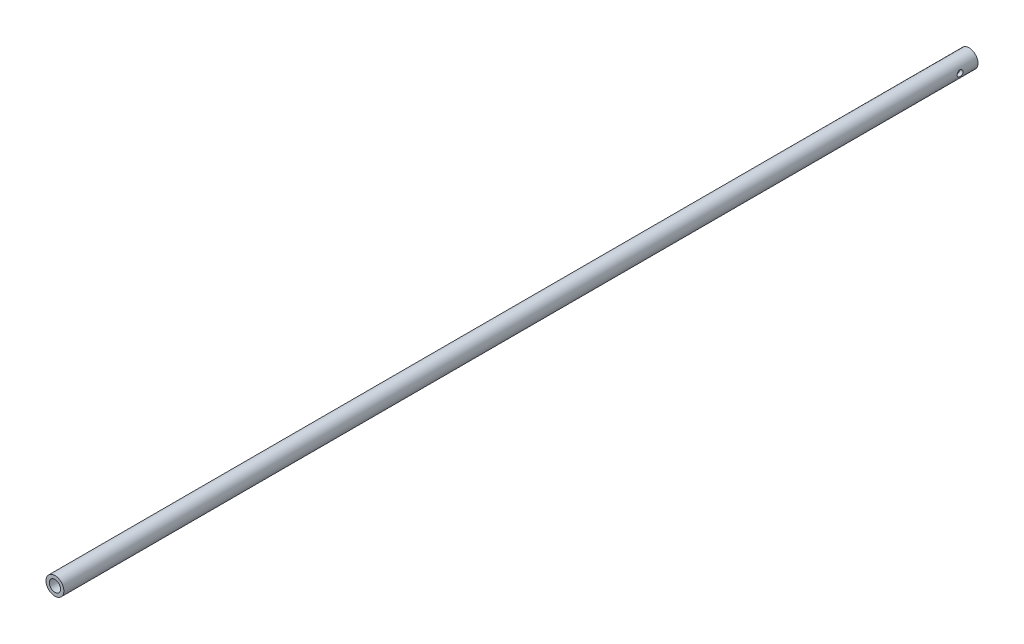
ISO-10303-21;
HEADER;
FILE_DESCRIPTION(('STEP AP214'),'2;1');
FILE_NAME('part.step','',(''),(''),'','','');
FILE_SCHEMA(('AUTOMOTIVE_DESIGN { 1 0 10303 214 1 1 1 1 }'));
ENDSEC;
DATA;
#1=APPLICATION_CONTEXT('core data for automotive mechanical design processes');
#2=APPLICATION_PROTOCOL_DEFINITION('international standard','automotive_design',2000,#1);
#3=PRODUCT_CONTEXT('',#1,'mechanical');
#4=PRODUCT('Part','Part','',(#3));
#5=PRODUCT_RELATED_PRODUCT_CATEGORY('part','',(#4));
#6=PRODUCT_DEFINITION_FORMATION('','',#4);
#7=PRODUCT_DEFINITION_CONTEXT('part definition',#1,'design');
#8=PRODUCT_DEFINITION('design','',#6,#7);
#9=PRODUCT_DEFINITION_SHAPE('','',#8);
#10=(LENGTH_UNIT() NAMED_UNIT(*) SI_UNIT(.MILLI.,.METRE.));
#11=(NAMED_UNIT(*) PLANE_ANGLE_UNIT() SI_UNIT($,.RADIAN.));
#12=(NAMED_UNIT(*) SI_UNIT($,.STERADIAN.) SOLID_ANGLE_UNIT());
#13=UNCERTAINTY_MEASURE_WITH_UNIT(LENGTH_MEASURE(1.E-05),#10,'distance_accuracy_value','');
#14=(GEOMETRIC_REPRESENTATION_CONTEXT(3) GLOBAL_UNCERTAINTY_ASSIGNED_CONTEXT((#13)) GLOBAL_UNIT_ASSIGNED_CONTEXT((#10,
#11,#12)) REPRESENTATION_CONTEXT('',''));
#15=CARTESIAN_POINT('',(0.,0.,0.));
#16=DIRECTION('',(0.,0.,1.));
#17=DIRECTION('',(1.,0.,0.));
#18=AXIS2_PLACEMENT_3D('',#15,#16,#17);
#19=CARTESIAN_POINT('',(0.,0.,243.84));
#20=DIRECTION('',(0.,0.,1.));
#21=DIRECTION('',(1.,0.,0.));
#22=AXIS2_PLACEMENT_3D('',#19,#20,#21);
#23=PLANE('',#22);
#24=CARTESIAN_POINT('',(0.,0.,243.84));
#25=DIRECTION('',(0.,0.,1.));
#26=DIRECTION('',(1.,0.,0.));
#27=AXIS2_PLACEMENT_3D('',#24,#25,#26);
#28=CIRCLE('',#27,2.3876);
#29=CARTESIAN_POINT('',(2.3876,0.,243.84));
#30=VERTEX_POINT('',#29);
#31=EDGE_CURVE('E10',#30,#30,#28,.T.);
#32=ORIENTED_EDGE('',*,*,#31,.T.);
#33=EDGE_LOOP('',(#32));
#34=FACE_BOUND('',#33,.T.);
#35=CARTESIAN_POINT('',(0.,0.,243.84));
#36=DIRECTION('',(0.,0.,1.));
#37=DIRECTION('',(1.,0.,0.));
#38=AXIS2_PLACEMENT_3D('',#35,#36,#37);
#39=CIRCLE('',#38,1.4986);
#40=CARTESIAN_POINT('',(1.4986,0.,243.84));
#41=VERTEX_POINT('',#40);
#42=EDGE_CURVE('E49',#41,#41,#39,.T.);
#43=ORIENTED_EDGE('',*,*,#42,.F.);
#44=EDGE_LOOP('',(#43));
#45=FACE_BOUND('',#44,.T.);
#46=ADVANCED_FACE('F31',(#34,#45),#23,.T.);
#47=CARTESIAN_POINT('',(0.,0.,0.));
#48=DIRECTION('',(0.,0.,1.));
#49=DIRECTION('',(1.,0.,0.));
#50=AXIS2_PLACEMENT_3D('',#47,#48,#49);
#51=PLANE('',#50);
#52=CARTESIAN_POINT('',(0.,0.,0.));
#53=DIRECTION('',(0.,0.,1.));
#54=DIRECTION('',(1.,0.,0.));
#55=AXIS2_PLACEMENT_3D('',#52,#53,#54);
#56=CIRCLE('',#55,2.3876);
#57=CARTESIAN_POINT('',(2.3876,0.,0.));
#58=VERTEX_POINT('',#57);
#59=EDGE_CURVE('E44',#58,#58,#56,.T.);
#60=ORIENTED_EDGE('',*,*,#59,.F.);
#61=EDGE_LOOP('',(#60));
#62=FACE_BOUND('',#61,.T.);
#63=CARTESIAN_POINT('',(0.,0.,0.));
#64=DIRECTION('',(0.,0.,1.));
#65=DIRECTION('',(1.,0.,0.));
#66=AXIS2_PLACEMENT_3D('',#63,#64,#65);
#67=CIRCLE('',#66,1.4986);
#68=CARTESIAN_POINT('',(1.4986,0.,0.));
#69=VERTEX_POINT('',#68);
#70=EDGE_CURVE('E52',#69,#69,#67,.T.);
#71=ORIENTED_EDGE('',*,*,#70,.T.);
#72=EDGE_LOOP('',(#71));
#73=FACE_BOUND('',#72,.T.);
#74=ADVANCED_FACE('F85',(#62,#73),#51,.F.);
#75=CARTESIAN_POINT('',(0.,0.,243.84));
#76=DIRECTION('',(0.,0.,-1.));
#77=DIRECTION('',(-1.,0.,0.));
#78=AXIS2_PLACEMENT_3D('',#75,#76,#77);
#79=CYLINDRICAL_SURFACE('',#78,2.3876);
#80=CARTESIAN_POINT('',(-2.3876,0.,3.96875));
#81=CARTESIAN_POINT('',(-2.387600104954,0.04331618713427,3.96874982141756));
#82=CARTESIAN_POINT('',(-2.38641034730664,0.0866313433192571,3.97230728899652));
#83=CARTESIAN_POINT('',(-2.38178134321832,0.171986217616656,3.98639988803204));
#84=CARTESIAN_POINT('',(-2.37834185140834,0.214025796083791,3.99693578059759));
#85=CARTESIAN_POINT('',(-2.36958719298901,0.295586633292587,4.02458444744971));
#86=CARTESIAN_POINT('',(-2.36427515302001,0.335111961065766,4.04168626266866));
#87=CARTESIAN_POINT('',(-2.35231787736739,0.410733349069189,4.08193191079319));
#88=CARTESIAN_POINT('',(-2.34567238094995,0.446828736598123,4.10507692560663));
#89=CARTESIAN_POINT('',(-2.33149162603547,0.515809889195975,4.15758996265754));
#90=CARTESIAN_POINT('',(-2.32393513707995,0.548561078257333,4.18712899830712));
#91=CARTESIAN_POINT('',(-2.30890113468207,0.608747489028168,4.25122794606544));
#92=CARTESIAN_POINT('',(-2.30142363884492,0.636181548393056,4.28578895311337));
#93=CARTESIAN_POINT('',(-2.28716089878583,0.685721479166213,4.360160324732));
#94=CARTESIAN_POINT('',(-2.28040153954085,0.707652707431604,4.40009246455093));
#95=CARTESIAN_POINT('',(-2.26866304334843,0.744430782618014,4.48333930923541));
#96=CARTESIAN_POINT('',(-2.26368336654978,0.759279778330762,4.52665298347593));
#97=CARTESIAN_POINT('',(-2.25629154604765,0.780967569009525,4.61390361676776));
#98=CARTESIAN_POINT('',(-2.2537988584141,0.788058418308084,4.65777089746612));
#99=CARTESIAN_POINT('',(-2.25142498297933,0.794816554072336,4.74613792777547));
#100=CARTESIAN_POINT('',(-2.25154299326961,0.794486120077496,4.7906374789797));
#101=CARTESIAN_POINT('',(-2.25430657392201,0.78660683748293,4.87685896957575));
#102=CARTESIAN_POINT('',(-2.25683708950154,0.779386558228351,4.91861526181227));
#103=CARTESIAN_POINT('',(-2.26395234914436,0.758468407488654,5.00028619104303));
#104=CARTESIAN_POINT('',(-2.26853733793094,0.744769764307596,5.04020060801315));
#105=CARTESIAN_POINT('',(-2.27932718406608,0.711067915908021,5.11780284353296));
#106=CARTESIAN_POINT('',(-2.2855568463045,0.690967102630071,5.15544467383786));
#107=CARTESIAN_POINT('',(-2.29892367992039,0.645099267013881,5.22692508684221));
#108=CARTESIAN_POINT('',(-2.30606111205869,0.619330615006975,5.26076257144424));
#109=CARTESIAN_POINT('',(-2.32089230801147,0.561279055390644,5.32552054078693));
#110=CARTESIAN_POINT('',(-2.32859571772908,0.528727421778223,5.35619840980791));
#111=CARTESIAN_POINT('',(-2.34336664467415,0.45884673949731,5.41172295777575));
#112=CARTESIAN_POINT('',(-2.35043410152258,0.421517238018774,5.43656908340097));
#113=CARTESIAN_POINT('',(-2.36322873023916,0.34262794242784,5.47991881401616));
#114=CARTESIAN_POINT('',(-2.36894205617047,0.301030199979737,5.49835772652146));
#115=CARTESIAN_POINT('',(-2.37828419008409,0.215088012977365,5.52790115902589));
#116=CARTESIAN_POINT('',(-2.38191371810039,0.170744523061257,5.53900821266899));
#117=CARTESIAN_POINT('',(-2.38656017760424,0.0826237435658498,5.55314353746814));
#118=CARTESIAN_POINT('',(-2.38768306787278,0.0389045626786965,5.55649967540858));
#119=CARTESIAN_POINT('',(-2.38750733002936,-0.0484807897908551,5.55597144121422));
#120=CARTESIAN_POINT('',(-2.38620910820413,-0.0921469690370237,5.55208828390528));
#121=CARTESIAN_POINT('',(-2.3814069364073,-0.176876625580169,5.53745128777215));
#122=CARTESIAN_POINT('',(-2.37796754978706,-0.217978840730672,5.52689842591333));
#123=CARTESIAN_POINT('',(-2.36929415723819,-0.297813099480496,5.4994725890578));
#124=CARTESIAN_POINT('',(-2.36405992270278,-0.336544840415545,5.48259880895099));
#125=CARTESIAN_POINT('',(-2.35215776873451,-0.411670876866391,5.44251930049423));
#126=CARTESIAN_POINT('',(-2.34545584925548,-0.447977229413894,5.41915911466913));
#127=CARTESIAN_POINT('',(-2.33137843043207,-0.516261414109196,5.36695154225324));
#128=CARTESIAN_POINT('',(-2.3240027266987,-0.548237925471455,5.33810248774977));
#129=CARTESIAN_POINT('',(-2.30898671836576,-0.608458157330225,5.2741942230661));
#130=CARTESIAN_POINT('',(-2.30134951552824,-0.636467943952485,5.23891331757426));
#131=CARTESIAN_POINT('',(-2.28701507580633,-0.686198082341363,5.16398806235609));
#132=CARTESIAN_POINT('',(-2.28031784560392,-0.707918389399131,5.12434368161471));
#133=CARTESIAN_POINT('',(-2.26868751511924,-0.744350614658596,5.04180450943163));
#134=CARTESIAN_POINT('',(-2.26375068754584,-0.759077362500693,4.99891682138304));
#135=CARTESIAN_POINT('',(-2.2562705976153,-0.781033878192632,4.91106839667613));
#136=CARTESIAN_POINT('',(-2.2537262645755,-0.788266999717382,4.86610859678239));
#137=CARTESIAN_POINT('',(-2.25144056067256,-0.794770276420756,4.77786423421202));
#138=CARTESIAN_POINT('',(-2.2515625812761,-0.794428511504645,4.73461149045411));
#139=CARTESIAN_POINT('',(-2.25425833857885,-0.786746017590526,4.64881394057495));
#140=CARTESIAN_POINT('',(-2.25683193083175,-0.779405700946309,4.6062690928948));
#141=CARTESIAN_POINT('',(-2.26403940423301,-0.75820853464893,4.52389002531972));
#142=CARTESIAN_POINT('',(-2.26863366415936,-0.744476721468039,4.48401989391558));
#143=CARTESIAN_POINT('',(-2.279350374539,-0.710987542677714,4.40711890186192));
#144=CARTESIAN_POINT('',(-2.2854731629997,-0.691228844113126,4.37008867157765));
#145=CARTESIAN_POINT('',(-2.29888867630584,-0.645245046617742,4.29817503194798));
#146=CARTESIAN_POINT('',(-2.30622067152414,-0.618776315877545,4.2634547766596));
#147=CARTESIAN_POINT('',(-2.32106325199321,-0.560536420619283,4.19882337826886));
#148=CARTESIAN_POINT('',(-2.32857388710218,-0.528763760529606,4.16891359628003));
#149=CARTESIAN_POINT('',(-2.34327631353338,-0.459341694996789,4.1135862488819));
#150=CARTESIAN_POINT('',(-2.35044452759944,-0.421512485361231,4.08838724766165));
#151=CARTESIAN_POINT('',(-2.36333382041995,-0.341919717168496,4.0447336186308));
#152=CARTESIAN_POINT('',(-2.36905527799824,-0.300157192463443,4.02627722474796));
#153=CARTESIAN_POINT('',(-2.37818050482714,-0.215877269984439,3.99743360510169));
#154=CARTESIAN_POINT('',(-2.38167954556196,-0.173484937915579,3.98671153215144));
#155=CARTESIAN_POINT('',(-2.38638892814132,-0.0873944812509105,3.97237078824566));
#156=CARTESIAN_POINT('',(-2.38759989412399,-0.0436967160542328,3.96875018015127));
#157=CARTESIAN_POINT('',(-2.3876,0.,3.96875));
#158=B_SPLINE_CURVE_WITH_KNOTS('',3,(#80,#81,#82,#83,#84,#85,#86,#87,#88,#89,#90,#91,#92,#93,
#94,#95,#96,#97,#98,#99,#100,#101,#102,#103,#104,#105,#106,#107,#108,#109,#110,#111,#112,#113,
#114,#115,#116,#117,#118,#119,#120,#121,#122,#123,#124,#125,#126,#127,#128,#129,#130,#131,#132,
#133,#134,#135,#136,#137,#138,#139,#140,#141,#142,#143,#144,#145,#146,#147,#148,#149,#150,#151,
#152,#153,#154,#155,#156,#157),.UNSPECIFIED.,.T.,.F.,(4,2,2,2,2,2,2,2,2,2,2,2,2,2,2,2,2,2,2,2,2,
2,2,2,2,2,2,2,2,2,2,2,2,2,2,2,2,2,4),(0.,0.129787768732333,0.259589695230469,0.38917590687746,
0.51878748155148,0.6524262908371,0.786094281200943,0.923581629359143,1.0610272364553,
1.19386103070647,1.32665402396379,1.45341505975981,1.58019119900268,1.70900098516398,
1.83784785641812,1.97338345216388,2.10893190246884,2.24581169574993,2.38264416317856,
2.51357331290481,2.64448049339282,2.7716197523065,2.89877521075353,3.02926548650142,
3.15979547808463,3.29622310821877,3.43265170812672,3.56878970890293,3.70486675653546,
3.83398914573841,3.9631039275365,4.08979265751137,4.2165094273411,4.34873121933904,
4.48099035765252,4.61836636682183,4.75570636763581,4.88667003984324,5.01759798278589),.UNSPECIFIED.);
#159=CARTESIAN_POINT('',(-2.3876,0.,3.96875));
#160=VERTEX_POINT('',#159);
#161=EDGE_CURVE('E75',#160,#160,#158,.T.);
#162=ORIENTED_EDGE('',*,*,#161,.T.);
#163=EDGE_LOOP('',(#162));
#164=FACE_BOUND('',#163,.T.);
#165=CARTESIAN_POINT('',(2.3876,0.,3.96875));
#166=CARTESIAN_POINT('',(2.387600104954,-0.0433161871342706,3.96874982141756));
#167=CARTESIAN_POINT('',(2.38641034730664,-0.0866313433192578,3.97230728899652));
#168=CARTESIAN_POINT('',(2.38178134321832,-0.171986217616656,3.98639988803204));
#169=CARTESIAN_POINT('',(2.37834185140834,-0.214025796083791,3.99693578059759));
#170=CARTESIAN_POINT('',(2.36958719298901,-0.295586633292588,4.02458444744971));
#171=CARTESIAN_POINT('',(2.36427515302001,-0.335111961065767,4.04168626266866));
#172=CARTESIAN_POINT('',(2.35231787736739,-0.41073334906919,4.08193191079319));
#173=CARTESIAN_POINT('',(2.34567238094995,-0.446828736598124,4.10507692560663));
#174=CARTESIAN_POINT('',(2.33149162603547,-0.515809889195977,4.15758996265754));
#175=CARTESIAN_POINT('',(2.32393513707995,-0.548561078257334,4.18712899830712));
#176=CARTESIAN_POINT('',(2.30890113468207,-0.608747489028169,4.25122794606544));
#177=CARTESIAN_POINT('',(2.30142363884492,-0.636181548393058,4.28578895311336));
#178=CARTESIAN_POINT('',(2.28716089878583,-0.685721479166214,4.360160324732));
#179=CARTESIAN_POINT('',(2.28040153954085,-0.707652707431605,4.40009246455093));
#180=CARTESIAN_POINT('',(2.26866304334843,-0.744430782618015,4.48333930923541));
#181=CARTESIAN_POINT('',(2.26368336654978,-0.759279778330763,4.52665298347593));
#182=CARTESIAN_POINT('',(2.25629154604765,-0.780967569009526,4.61390361676776));
#183=CARTESIAN_POINT('',(2.2537988584141,-0.788058418308085,4.65777089746612));
#184=CARTESIAN_POINT('',(2.25142498297933,-0.794816554072337,4.74613792777547));
#185=CARTESIAN_POINT('',(2.25154299326961,-0.794486120077497,4.7906374789797));
#186=CARTESIAN_POINT('',(2.25430657392201,-0.786606837482931,4.87685896957575));
#187=CARTESIAN_POINT('',(2.25683708950154,-0.779386558228352,4.91861526181227));
#188=CARTESIAN_POINT('',(2.26395234914436,-0.758468407488655,5.00028619104303));
#189=CARTESIAN_POINT('',(2.26853733793094,-0.744769764307597,5.04020060801315));
#190=CARTESIAN_POINT('',(2.27932718406608,-0.711067915908023,5.11780284353296));
#191=CARTESIAN_POINT('',(2.2855568463045,-0.690967102630072,5.15544467383786));
#192=CARTESIAN_POINT('',(2.29892367992039,-0.645099267013882,5.22692508684221));
#193=CARTESIAN_POINT('',(2.30606111205869,-0.619330615006976,5.26076257144424));
#194=CARTESIAN_POINT('',(2.32089230801147,-0.561279055390645,5.32552054078693));
#195=CARTESIAN_POINT('',(2.32859571772908,-0.528727421778224,5.35619840980791));
#196=CARTESIAN_POINT('',(2.34336664467415,-0.458846739497311,5.41172295777575));
#197=CARTESIAN_POINT('',(2.35043410152258,-0.421517238018775,5.43656908340097));
#198=CARTESIAN_POINT('',(2.36322873023916,-0.342627942427841,5.47991881401616));
#199=CARTESIAN_POINT('',(2.36894205617047,-0.301030199979738,5.49835772652146));
#200=CARTESIAN_POINT('',(2.37828419008409,-0.215088012977367,5.52790115902589));
#201=CARTESIAN_POINT('',(2.38191371810039,-0.170744523061258,5.53900821266899));
#202=CARTESIAN_POINT('',(2.38656017760424,-0.0826237435658511,5.55314353746814));
#203=CARTESIAN_POINT('',(2.38768306787278,-0.0389045626786979,5.55649967540858));
#204=CARTESIAN_POINT('',(2.38750733002936,0.0484807897908537,5.55597144121422));
#205=CARTESIAN_POINT('',(2.38620910820413,0.0921469690370224,5.55208828390528));
#206=CARTESIAN_POINT('',(2.3814069364073,0.176876625580168,5.53745128777215));
#207=CARTESIAN_POINT('',(2.37796754978706,0.217978840730671,5.52689842591333));
#208=CARTESIAN_POINT('',(2.36929415723819,0.297813099480494,5.4994725890578));
#209=CARTESIAN_POINT('',(2.36405992270278,0.336544840415544,5.48259880895099));
#210=CARTESIAN_POINT('',(2.35215776873451,0.41167087686639,5.44251930049423));
#211=CARTESIAN_POINT('',(2.34545584925548,0.447977229413893,5.41915911466913));
#212=CARTESIAN_POINT('',(2.33137843043207,0.516261414109195,5.36695154225324));
#213=CARTESIAN_POINT('',(2.3240027266987,0.548237925471454,5.33810248774977));
#214=CARTESIAN_POINT('',(2.30898671836576,0.608458157330224,5.2741942230661));
#215=CARTESIAN_POINT('',(2.30134951552824,0.636467943952484,5.23891331757426));
#216=CARTESIAN_POINT('',(2.28701507580633,0.686198082341362,5.16398806235609));
#217=CARTESIAN_POINT('',(2.28031784560392,0.70791838939913,5.12434368161471));
#218=CARTESIAN_POINT('',(2.26868751511924,0.744350614658595,5.04180450943163));
#219=CARTESIAN_POINT('',(2.26375068754584,0.759077362500692,4.99891682138304));
#220=CARTESIAN_POINT('',(2.2562705976153,0.781033878192631,4.91106839667613));
#221=CARTESIAN_POINT('',(2.2537262645755,0.788266999717381,4.86610859678239));
#222=CARTESIAN_POINT('',(2.25144056067256,0.794770276420754,4.77786423421202));
#223=CARTESIAN_POINT('',(2.2515625812761,0.794428511504644,4.73461149045411));
#224=CARTESIAN_POINT('',(2.25425833857885,0.786746017590525,4.64881394057495));
#225=CARTESIAN_POINT('',(2.25683193083175,0.779405700946308,4.6062690928948));
#226=CARTESIAN_POINT('',(2.26403940423301,0.758208534648929,4.52389002531972));
#227=CARTESIAN_POINT('',(2.26863366415936,0.744476721468038,4.48401989391559));
#228=CARTESIAN_POINT('',(2.279350374539,0.710987542677713,4.40711890186192));
#229=CARTESIAN_POINT('',(2.2854731629997,0.691228844113126,4.37008867157766));
#230=CARTESIAN_POINT('',(2.29888867630584,0.645245046617741,4.29817503194798));
#231=CARTESIAN_POINT('',(2.30622067152414,0.618776315877545,4.2634547766596));
#232=CARTESIAN_POINT('',(2.32106325199321,0.560536420619283,4.19882337826886));
#233=CARTESIAN_POINT('',(2.32857388710218,0.528763760529605,4.16891359628003));
#234=CARTESIAN_POINT('',(2.34327631353338,0.459341694996788,4.1135862488819));
#235=CARTESIAN_POINT('',(2.35044452759944,0.42151248536123,4.08838724766165));
#236=CARTESIAN_POINT('',(2.36333382041995,0.341919717168495,4.0447336186308));
#237=CARTESIAN_POINT('',(2.36905527799824,0.300157192463442,4.02627722474796));
#238=CARTESIAN_POINT('',(2.37818050482714,0.215877269984438,3.99743360510169));
#239=CARTESIAN_POINT('',(2.38167954556196,0.173484937915578,3.98671153215144));
#240=CARTESIAN_POINT('',(2.38638892814132,0.0873944812509096,3.97237078824566));
#241=CARTESIAN_POINT('',(2.38759989412399,0.0436967160542321,3.96875018015127));
#242=CARTESIAN_POINT('',(2.3876,0.,3.96875));
#243=B_SPLINE_CURVE_WITH_KNOTS('',3,(#165,#166,#167,#168,#169,#170,#171,#172,#173,#174,#175,
#176,#177,#178,#179,#180,#181,#182,#183,#184,#185,#186,#187,#188,#189,#190,#191,#192,#193,#194,
#195,#196,#197,#198,#199,#200,#201,#202,#203,#204,#205,#206,#207,#208,#209,#210,#211,#212,#213,
#214,#215,#216,#217,#218,#219,#220,#221,#222,#223,#224,#225,#226,#227,#228,#229,#230,#231,#232,
#233,#234,#235,#236,#237,#238,#239,#240,#241,#242),.UNSPECIFIED.,.T.,.F.,(4,2,2,2,2,2,2,2,2,2,2,
2,2,2,2,2,2,2,2,2,2,2,2,2,2,2,2,2,2,2,2,2,2,2,2,2,2,2,4),(0.,0.129787768732333,
0.259589695230469,0.38917590687746,0.51878748155148,0.6524262908371,0.786094281200944,
0.923581629359143,1.0610272364553,1.19386103070647,1.32665402396379,1.45341505975981,
1.58019119900268,1.70900098516398,1.83784785641812,1.97338345216388,2.10893190246884,
2.24581169574993,2.38264416317856,2.51357331290481,2.64448049339282,2.7716197523065,
2.89877521075353,3.02926548650142,3.15979547808463,3.29622310821877,3.43265170812672,
3.56878970890293,3.70486675653546,3.83398914573841,3.9631039275365,4.08979265751137,
4.2165094273411,4.34873121933904,4.48099035765252,4.61836636682183,4.75570636763581,
4.88667003984324,5.01759798278589),.UNSPECIFIED.);
#244=CARTESIAN_POINT('',(2.3876,0.,3.96875));
#245=VERTEX_POINT('',#244);
#246=EDGE_CURVE('E71',#245,#245,#243,.T.);
#247=ORIENTED_EDGE('',*,*,#246,.T.);
#248=EDGE_LOOP('',(#247));
#249=FACE_BOUND('',#248,.T.);
#250=ORIENTED_EDGE('',*,*,#31,.F.);
#251=EDGE_LOOP('',(#250));
#252=FACE_BOUND('',#251,.T.);
#253=ORIENTED_EDGE('',*,*,#59,.T.);
#254=EDGE_LOOP('',(#253));
#255=FACE_BOUND('',#254,.T.);
#256=ADVANCED_FACE('F33',(#164,#249,#252,#255),#79,.T.);
#257=CARTESIAN_POINT('',(0.,0.,243.84));
#258=DIRECTION('',(0.,0.,-1.));
#259=DIRECTION('',(-1.,0.,0.));
#260=AXIS2_PLACEMENT_3D('',#257,#258,#259);
#261=CYLINDRICAL_SURFACE('',#260,1.4986);
#262=CARTESIAN_POINT('',(-1.4986,0.,5.55625));
#263=CARTESIAN_POINT('',(-1.49859760212751,-0.0414263612192378,5.55624730431667));
#264=CARTESIAN_POINT('',(-1.49686436348053,-0.0828929247988009,5.55298799319719));
#265=CARTESIAN_POINT('',(-1.49010137281883,-0.164581418939262,5.54010406888301));
#266=CARTESIAN_POINT('',(-1.48506638384472,-0.204801265750169,5.53046934332007));
#267=CARTESIAN_POINT('',(-1.47222226504384,-0.282694075510962,5.50532666136518));
#268=CARTESIAN_POINT('',(-1.46442432540662,-0.320376592808223,5.48984237967721));
#269=CARTESIAN_POINT('',(-1.44675323896058,-0.392542076330521,5.45357336374158));
#270=CARTESIAN_POINT('',(-1.43688010095347,-0.427025056125145,5.43278865197503));
#271=CARTESIAN_POINT('',(-1.41518536096982,-0.494351884164135,5.38497105957693));
#272=CARTESIAN_POINT('',(-1.40327850050875,-0.526940500800641,5.35761813679425));
#273=CARTESIAN_POINT('',(-1.3791053883703,-0.587307110161824,5.2981375905065));
#274=CARTESIAN_POINT('',(-1.36683883716908,-0.615080952362877,5.2660058913987));
#275=CARTESIAN_POINT('',(-1.34205467804449,-0.667537433464461,5.19444090023999));
#276=CARTESIAN_POINT('',(-1.32961312897755,-0.691719814042879,5.15461128393169));
#277=CARTESIAN_POINT('',(-1.30734357266104,-0.732944073997046,5.07073795946099));
#278=CARTESIAN_POINT('',(-1.29751356124843,-0.7499914347909,5.02669751830163));
#279=CARTESIAN_POINT('',(-1.28255232513881,-0.775285043162325,4.93841258495542));
#280=CARTESIAN_POINT('',(-1.27716648558021,-0.784013498872538,4.89435179388255));
#281=CARTESIAN_POINT('',(-1.27106462553461,-0.793873073104531,4.80509083192078));
#282=CARTESIAN_POINT('',(-1.27034286638432,-0.795013527919281,4.75989212991486));
#283=CARTESIAN_POINT('',(-1.27345130765446,-0.790016682393103,4.67637980825798));
#284=CARTESIAN_POINT('',(-1.27666593725476,-0.784863825999241,4.63797828566044));
#285=CARTESIAN_POINT('',(-1.28619156164765,-0.769153317771953,4.56269631098913));
#286=CARTESIAN_POINT('',(-1.29250376923312,-0.758593548902915,4.52581646083111));
#287=CARTESIAN_POINT('',(-1.30763724929117,-0.732203066962817,4.45358065362281));
#288=CARTESIAN_POINT('',(-1.31651204215332,-0.716258538811285,4.41827803006849));
#289=CARTESIAN_POINT('',(-1.33578206124318,-0.679643975305537,4.3506714276898));
#290=CARTESIAN_POINT('',(-1.34617796309103,-0.658971837813693,4.31836879182522));
#291=CARTESIAN_POINT('',(-1.36913072652561,-0.6100118011622,4.25276164159088));
#292=CARTESIAN_POINT('',(-1.38178267797636,-0.581054870204912,4.21998782784746));
#293=CARTESIAN_POINT('',(-1.40662063707691,-0.518042393423699,4.15952474047375));
#294=CARTESIAN_POINT('',(-1.41880636427142,-0.483983837446321,4.13183849032147));
#295=CARTESIAN_POINT('',(-1.44219524065988,-0.409258712913348,4.08080474515345));
#296=CARTESIAN_POINT('',(-1.45330043425654,-0.368323482240297,4.05780195030507));
#297=CARTESIAN_POINT('',(-1.47240062241939,-0.282430832537545,4.01920803576588));
#298=CARTESIAN_POINT('',(-1.48039835850722,-0.237477002150027,4.00361038026023));
#299=CARTESIAN_POINT('',(-1.49176805600282,-0.149112845164182,3.98167455137648));
#300=CARTESIAN_POINT('',(-1.49548880875758,-0.105922129683843,3.97463492716705));
#301=CARTESIAN_POINT('',(-1.49911418636198,-0.0188205900186427,3.96777368301533));
#302=CARTESIAN_POINT('',(-1.49902097005481,0.0250898127267499,3.96794797973589));
#303=CARTESIAN_POINT('',(-1.49521594586904,0.108204598288325,3.97515331890375));
#304=CARTESIAN_POINT('',(-1.49182764935004,0.14747938629773,3.98157136929495));
#305=CARTESIAN_POINT('',(-1.4822245752013,0.224301739961207,4.00007674462525));
#306=CARTESIAN_POINT('',(-1.47600950169611,0.261849124356844,4.01216466302695));
#307=CARTESIAN_POINT('',(-1.46110650492337,0.335275951366679,4.04191761844223));
#308=CARTESIAN_POINT('',(-1.45235973568988,0.371088729087012,4.05971661985034));
#309=CARTESIAN_POINT('',(-1.4331970812554,0.439324559170392,4.10022420430347));
#310=CARTESIAN_POINT('',(-1.42278053693806,0.471746264577219,4.12293472733225));
#311=CARTESIAN_POINT('',(-1.39994000327348,0.535958259480256,4.17540089759423));
#312=CARTESIAN_POINT('',(-1.38742040870082,0.567312131289893,4.2056496818207));
#313=CARTESIAN_POINT('',(-1.36253694416735,0.624720756274996,4.27091632010473));
#314=CARTESIAN_POINT('',(-1.35017322372301,0.65077073818402,4.30593842127844));
#315=CARTESIAN_POINT('',(-1.32615872337997,0.698472770040636,4.38257717649924));
#316=CARTESIAN_POINT('',(-1.31460677922833,0.719728028188898,4.42447473447175));
#317=CARTESIAN_POINT('',(-1.29486940385448,0.754667398941047,4.51204043681823));
#318=CARTESIAN_POINT('',(-1.28667921998356,0.768362209559858,4.55770314773489));
#319=CARTESIAN_POINT('',(-1.27569765131961,0.786447567707199,4.64675852308973));
#320=CARTESIAN_POINT('',(-1.2724559672109,0.791618190848723,4.68993532651271));
#321=CARTESIAN_POINT('',(-1.27046842684645,0.794806520125637,4.77664472405048));
#322=CARTESIAN_POINT('',(-1.2717196566166,0.792828862423902,4.82017706929588));
#323=CARTESIAN_POINT('',(-1.27807787220214,0.782525763525834,4.90088209959152));
#324=CARTESIAN_POINT('',(-1.28271048892966,0.774980128003527,4.93819721528545));
#325=CARTESIAN_POINT('',(-1.29468477778551,0.754804653766391,5.01096639934251));
#326=CARTESIAN_POINT('',(-1.30202743497382,0.742172966194211,5.04641978563507));
#327=CARTESIAN_POINT('',(-1.31916823824137,0.711285707353476,5.11703157259835));
#328=CARTESIAN_POINT('',(-1.3290948878865,0.692718166019964,5.15202127143997));
#329=CARTESIAN_POINT('',(-1.35011498813662,0.650800453167622,5.21862284497535));
#330=CARTESIAN_POINT('',(-1.36120906553108,0.627447706043034,5.25023288658872));
#331=CARTESIAN_POINT('',(-1.38519756631102,0.572749680662823,5.31385964182614));
#332=CARTESIAN_POINT('',(-1.39812392033075,0.540740330136041,5.34529660680724));
#333=CARTESIAN_POINT('',(-1.42292920620429,0.471616870464051,5.40252355495103));
#334=CARTESIAN_POINT('',(-1.43480747197218,0.434499552886016,5.42830996226698));
#335=CARTESIAN_POINT('',(-1.45653113178679,0.355038093911756,5.47392913607082));
#336=CARTESIAN_POINT('',(-1.4663258244432,0.31259660539179,5.4936178063531));
#337=CARTESIAN_POINT('',(-1.48238133180263,0.224370828626128,5.52531066741063));
#338=CARTESIAN_POINT('',(-1.48865165284724,0.178595912566508,5.53733554172026));
#339=CARTESIAN_POINT('',(-1.49470067715357,0.110243075402109,5.54886817096148));
#340=CARTESIAN_POINT('',(-1.49615800401274,0.08831573787659,5.55163129127842));
#341=CARTESIAN_POINT('',(-1.49810831368663,0.0442627622920355,5.55532294045229));
#342=CARTESIAN_POINT('',(-1.49860128135786,0.0221371211244868,5.55625144049989));
#343=CARTESIAN_POINT('',(-1.4986,0.,5.55625));
#344=B_SPLINE_CURVE_WITH_KNOTS('',3,(#262,#263,#264,#265,#266,#267,#268,#269,#270,#271,#272,
#273,#274,#275,#276,#277,#278,#279,#280,#281,#282,#283,#284,#285,#286,#287,#288,#289,#290,#291,
#292,#293,#294,#295,#296,#297,#298,#299,#300,#301,#302,#303,#304,#305,#306,#307,#308,#309,#310,
#311,#312,#313,#314,#315,#316,#317,#318,#319,#320,#321,#322,#323,#324,#325,#326,#327,#328,#329,
#330,#331,#332,#333,#334,#335,#336,#337,#338,#339,#340,#341,#342,#343),.UNSPECIFIED.,.T.,.F.,(4,
2,2,2,2,2,2,2,2,2,2,2,2,2,2,2,2,2,2,2,2,2,2,2,2,2,2,2,2,2,2,2,2,2,2,2,2,2,2,2,4),(0.,
0.124189712990972,0.24857688328346,0.372465927416022,0.496354446097656,0.62835621149492,
0.760471207763729,0.904428843033289,1.04827568017283,1.18315946911092,1.31787726599905,
1.43396854963346,1.5501053227286,1.66886885232667,1.78768529331273,1.9236847466741,
2.05976476332111,2.20373590376772,2.34757973720767,2.47860136190678,2.60954882469673,
2.72881608709405,2.84809583592994,2.97040779536817,3.09276815487919,3.22818319881429,
3.36371952619954,3.50808077080391,3.65223721757954,3.78227106210681,3.91222058567769,
4.02677447333147,4.14137004071723,4.26340817661175,4.38551217209434,4.52495651896084,
4.66448885727572,4.80710341252813,4.94933142229053,5.01569398631573,5.08205759243472),.UNSPECIFIED.);
#345=CARTESIAN_POINT('',(-1.4986,0.,5.55625));
#346=VERTEX_POINT('',#345);
#347=EDGE_CURVE('E36',#346,#346,#344,.T.);
#348=ORIENTED_EDGE('',*,*,#347,.F.);
#349=EDGE_LOOP('',(#348));
#350=FACE_BOUND('',#349,.T.);
#351=CARTESIAN_POINT('',(1.4986,0.,3.96875));
#352=CARTESIAN_POINT('',(1.49859760212751,-0.0414263612192394,3.96875269568334));
#353=CARTESIAN_POINT('',(1.49686436348053,-0.0828929247988035,3.97201200680281));
#354=CARTESIAN_POINT('',(1.49010137281883,-0.164581418939266,3.98489593111699));
#355=CARTESIAN_POINT('',(1.48506638384472,-0.204801265750174,3.99453065667993));
#356=CARTESIAN_POINT('',(1.47222226504384,-0.282694075510968,4.01967333863482));
#357=CARTESIAN_POINT('',(1.46442432540662,-0.320376592808229,4.03515762032279));
#358=CARTESIAN_POINT('',(1.44675323896057,-0.392542076330529,4.07142663625842));
#359=CARTESIAN_POINT('',(1.43688010095347,-0.427025056125154,4.09221134802498));
#360=CARTESIAN_POINT('',(1.41518536096982,-0.494351884164144,4.14002894042308));
#361=CARTESIAN_POINT('',(1.40327850050875,-0.52694050080065,4.16738186320576));
#362=CARTESIAN_POINT('',(1.3791053883703,-0.587307110161833,4.22686240949351));
#363=CARTESIAN_POINT('',(1.36683883716908,-0.615080952362886,4.25899410860131));
#364=CARTESIAN_POINT('',(1.34205467804449,-0.667537433464468,4.33055909976002));
#365=CARTESIAN_POINT('',(1.32961312897755,-0.691719814042884,4.37038871606832));
#366=CARTESIAN_POINT('',(1.30734357266104,-0.73294407399705,4.45426204053902));
#367=CARTESIAN_POINT('',(1.29751356124843,-0.749991434790902,4.49830248169838));
#368=CARTESIAN_POINT('',(1.28255232513881,-0.775285043162326,4.58658741504458));
#369=CARTESIAN_POINT('',(1.27716648558021,-0.784013498872538,4.63064820611745));
#370=CARTESIAN_POINT('',(1.27106462553462,-0.793873073104531,4.71990916807921));
#371=CARTESIAN_POINT('',(1.27034286638432,-0.795013527919281,4.76510787008513));
#372=CARTESIAN_POINT('',(1.27345130765446,-0.790016682393104,4.84862019174201));
#373=CARTESIAN_POINT('',(1.27666593725476,-0.784863825999242,4.88702171433955));
#374=CARTESIAN_POINT('',(1.28619156164765,-0.769153317771957,4.96230368901086));
#375=CARTESIAN_POINT('',(1.29250376923312,-0.758593548902919,4.99918353916888));
#376=CARTESIAN_POINT('',(1.30763724929116,-0.732203066962822,5.07141934637718));
#377=CARTESIAN_POINT('',(1.31651204215332,-0.716258538811291,5.1067219699315));
#378=CARTESIAN_POINT('',(1.33578206124318,-0.679643975305543,5.17432857231019));
#379=CARTESIAN_POINT('',(1.34617796309103,-0.658971837813698,5.20663120817478));
#380=CARTESIAN_POINT('',(1.36913072652561,-0.610011801162203,5.27223835840911));
#381=CARTESIAN_POINT('',(1.38178267797636,-0.581054870204914,5.30501217215254));
#382=CARTESIAN_POINT('',(1.40662063707691,-0.518042393423698,5.36547525952625));
#383=CARTESIAN_POINT('',(1.41880636427142,-0.483983837446318,5.39316150967853));
#384=CARTESIAN_POINT('',(1.44219524065988,-0.409258712913342,5.44419525484655));
#385=CARTESIAN_POINT('',(1.45330043425654,-0.36832348224029,5.46719804969493));
#386=CARTESIAN_POINT('',(1.47240062241939,-0.282430832537535,5.50579196423413));
#387=CARTESIAN_POINT('',(1.48039835850722,-0.237477002150017,5.52138961973977));
#388=CARTESIAN_POINT('',(1.49176805600282,-0.14911284516417,5.54332544862352));
#389=CARTESIAN_POINT('',(1.49548880875758,-0.105922129683832,5.55036507283295));
#390=CARTESIAN_POINT('',(1.49911418636198,-0.0188205900186328,5.55722631698467));
#391=CARTESIAN_POINT('',(1.49902097005481,0.025089812726759,5.55705202026411));
#392=CARTESIAN_POINT('',(1.49521594586904,0.108204598288332,5.54984668109624));
#393=CARTESIAN_POINT('',(1.49182764935004,0.147479386297735,5.54342863070505));
#394=CARTESIAN_POINT('',(1.4822245752013,0.22430173996121,5.52492325537474));
#395=CARTESIAN_POINT('',(1.47600950169611,0.261849124356846,5.51283533697305));
#396=CARTESIAN_POINT('',(1.46110650492337,0.335275951366679,5.48308238155777));
#397=CARTESIAN_POINT('',(1.45235973568988,0.371088729087011,5.46528338014967));
#398=CARTESIAN_POINT('',(1.4331970812554,0.439324559170389,5.42477579569654));
#399=CARTESIAN_POINT('',(1.42278053693806,0.471746264577215,5.40206527266775));
#400=CARTESIAN_POINT('',(1.39994000327348,0.535958259480253,5.34959910240577));
#401=CARTESIAN_POINT('',(1.38742040870082,0.567312131289889,5.31935031817931));
#402=CARTESIAN_POINT('',(1.36253694416735,0.624720756274993,5.25408367989528));
#403=CARTESIAN_POINT('',(1.35017322372301,0.650770738184017,5.21906157872157));
#404=CARTESIAN_POINT('',(1.32615872337997,0.698472770040634,5.14242282350077));
#405=CARTESIAN_POINT('',(1.31460677922833,0.719728028188897,5.10052526552825));
#406=CARTESIAN_POINT('',(1.29486940385448,0.754667398941048,5.01295956318176));
#407=CARTESIAN_POINT('',(1.28667921998356,0.768362209559859,4.9672968522651));
#408=CARTESIAN_POINT('',(1.27569765131961,0.786447567707201,4.87824147691027));
#409=CARTESIAN_POINT('',(1.2724559672109,0.791618190848724,4.83506467348728));
#410=CARTESIAN_POINT('',(1.27046842684645,0.794806520125637,4.74835527594951));
#411=CARTESIAN_POINT('',(1.2717196566166,0.792828862423901,4.7048229307041));
#412=CARTESIAN_POINT('',(1.27807787220215,0.782525763525831,4.62411790040846));
#413=CARTESIAN_POINT('',(1.28271048892967,0.774980128003523,4.58680278471453));
#414=CARTESIAN_POINT('',(1.29468477778552,0.754804653766386,4.51403360065747));
#415=CARTESIAN_POINT('',(1.30202743497382,0.742172966194205,4.47858021436491));
#416=CARTESIAN_POINT('',(1.31916823824137,0.711285707353468,4.40796842740164));
#417=CARTESIAN_POINT('',(1.3290948878865,0.692718166019956,4.37297872856002));
#418=CARTESIAN_POINT('',(1.35011498813663,0.650800453167614,4.30637715502464));
#419=CARTESIAN_POINT('',(1.36120906553108,0.627447706043026,4.27476711341127));
#420=CARTESIAN_POINT('',(1.38519756631102,0.572749680662816,4.21114035817385));
#421=CARTESIAN_POINT('',(1.39812392033075,0.540740330136035,4.17970339319275));
#422=CARTESIAN_POINT('',(1.42292920620429,0.471616870464049,4.12247644504896));
#423=CARTESIAN_POINT('',(1.43480747197218,0.434499552886015,4.09669003773302));
#424=CARTESIAN_POINT('',(1.45653113178679,0.355038093911757,4.05107086392918));
#425=CARTESIAN_POINT('',(1.4663258244432,0.312596605391792,4.0313821936469));
#426=CARTESIAN_POINT('',(1.48238133180263,0.224370828626132,3.99968933258938));
#427=CARTESIAN_POINT('',(1.48865165284724,0.178595912566513,3.98766445827975));
#428=CARTESIAN_POINT('',(1.49470067715357,0.110243075402114,3.97613182903853));
#429=CARTESIAN_POINT('',(1.49615800401274,0.0883157378765936,3.97336870872158));
#430=CARTESIAN_POINT('',(1.49810831368664,0.0442627622920369,3.96967705954771));
#431=CARTESIAN_POINT('',(1.49860128135786,0.0221371211244872,3.96874855950012));
#432=CARTESIAN_POINT('',(1.4986,0.,3.96875));
#433=B_SPLINE_CURVE_WITH_KNOTS('',3,(#351,#352,#353,#354,#355,#356,#357,#358,#359,#360,#361,
#362,#363,#364,#365,#366,#367,#368,#369,#370,#371,#372,#373,#374,#375,#376,#377,#378,#379,#380,
#381,#382,#383,#384,#385,#386,#387,#388,#389,#390,#391,#392,#393,#394,#395,#396,#397,#398,#399,
#400,#401,#402,#403,#404,#405,#406,#407,#408,#409,#410,#411,#412,#413,#414,#415,#416,#417,#418,
#419,#420,#421,#422,#423,#424,#425,#426,#427,#428,#429,#430,#431,#432),.UNSPECIFIED.,.T.,.F.,(4,
2,2,2,2,2,2,2,2,2,2,2,2,2,2,2,2,2,2,2,2,2,2,2,2,2,2,2,2,2,2,2,2,2,2,2,2,2,2,2,4),(0.,
0.124189712990975,0.248576883283464,0.372465927416029,0.496354446097666,0.628356211494932,
0.760471207763742,0.904428843033298,1.04827568017284,1.18315946911092,1.31787726599904,
1.43396854963345,1.55010532272858,1.66886885232666,1.78768529331272,1.9236847466741,
2.05976476332111,2.20373590376773,2.34757973720768,2.47860136190679,2.60954882469674,
2.72881608709406,2.84809583592994,2.97040779536817,3.09276815487918,3.22818319881428,
3.36371952619954,3.50808077080391,3.65223721757955,3.78227106210682,3.91222058567771,
4.02677447333148,4.14137004071724,4.26340817661177,4.38551217209435,4.52495651896085,
4.66448885727571,4.80710341252812,4.94933142229052,5.01569398631572,5.08205759243472),.UNSPECIFIED.);
#434=CARTESIAN_POINT('',(1.4986,0.,3.96875));
#435=VERTEX_POINT('',#434);
#436=EDGE_CURVE('E54',#435,#435,#433,.T.);
#437=ORIENTED_EDGE('',*,*,#436,.F.);
#438=EDGE_LOOP('',(#437));
#439=FACE_BOUND('',#438,.T.);
#440=ORIENTED_EDGE('',*,*,#42,.T.);
#441=EDGE_LOOP('',(#440));
#442=FACE_BOUND('',#441,.T.);
#443=ORIENTED_EDGE('',*,*,#70,.F.);
#444=EDGE_LOOP('',(#443));
#445=FACE_BOUND('',#444,.T.);
#446=ADVANCED_FACE('F58',(#350,#439,#442,#445),#261,.F.);
#447=CARTESIAN_POINT('',(-2.3876,0.,4.7625));
#448=DIRECTION('',(1.,0.,0.));
#449=DIRECTION('',(0.,0.,-1.));
#450=AXIS2_PLACEMENT_3D('',#447,#448,#449);
#451=CYLINDRICAL_SURFACE('',#450,0.79375);
#452=ORIENTED_EDGE('',*,*,#436,.T.);
#453=EDGE_LOOP('',(#452));
#454=FACE_BOUND('',#453,.T.);
#455=ORIENTED_EDGE('',*,*,#246,.F.);
#456=EDGE_LOOP('',(#455));
#457=FACE_BOUND('',#456,.T.);
#458=ADVANCED_FACE('F64',(#454,#457),#451,.F.);
#459=ORIENTED_EDGE('',*,*,#347,.T.);
#460=EDGE_LOOP('',(#459));
#461=FACE_BOUND('',#460,.T.);
#462=ORIENTED_EDGE('',*,*,#161,.F.);
#463=EDGE_LOOP('',(#462));
#464=FACE_BOUND('',#463,.T.);
#465=ADVANCED_FACE('F61',(#461,#464),#451,.F.);
#466=CLOSED_SHELL('',(#46,#74,#256,#446,#458,#465));
#467=MANIFOLD_SOLID_BREP('B2',#466);
#468=ADVANCED_BREP_SHAPE_REPRESENTATION('',(#18,#467),#14);
#469=SHAPE_DEFINITION_REPRESENTATION(#9,#468);
ENDSEC;
END-ISO-10303-21;
